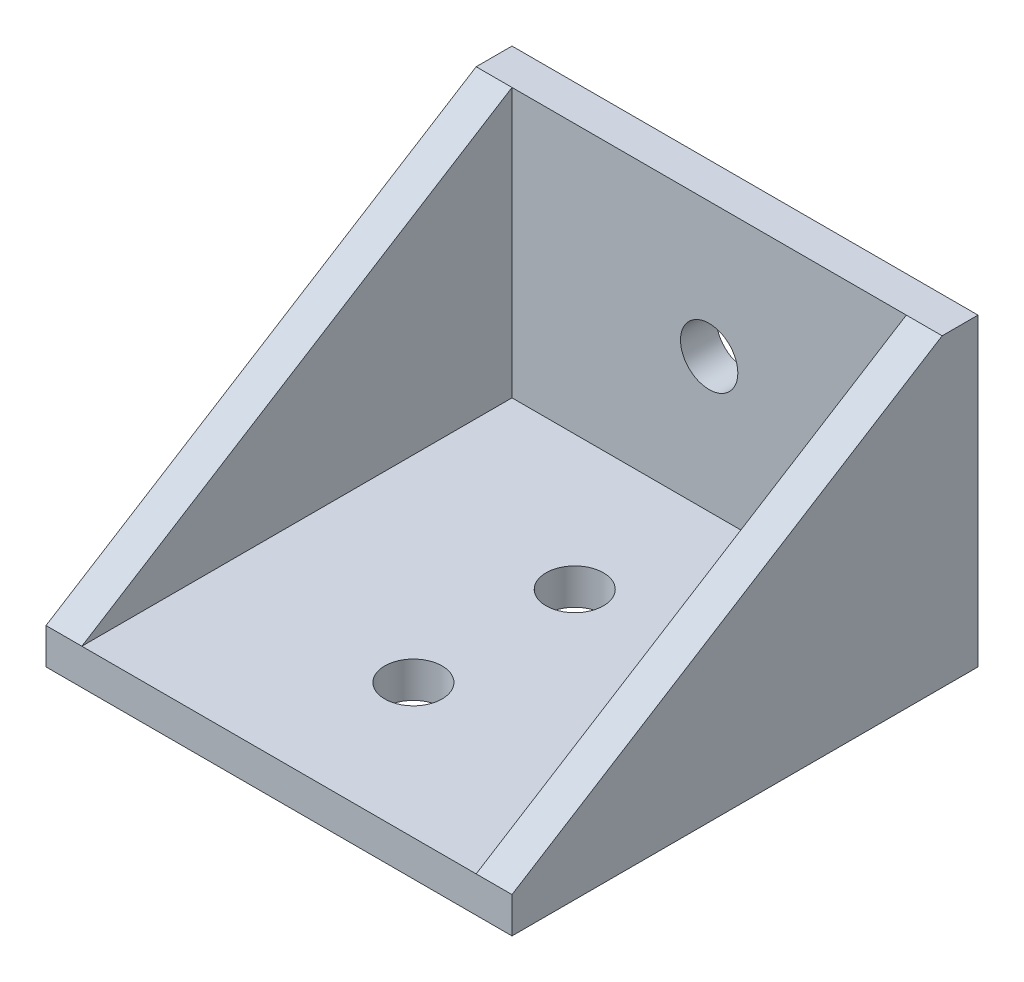
ISO-10303-21;
HEADER;
FILE_DESCRIPTION(('STEP AP214'),'2;1');
FILE_NAME('part.step','',(''),(''),'','','');
FILE_SCHEMA(('AUTOMOTIVE_DESIGN { 1 0 10303 214 1 1 1 1 }'));
ENDSEC;
DATA;
#1=APPLICATION_CONTEXT('core data for automotive mechanical design processes');
#2=APPLICATION_PROTOCOL_DEFINITION('international standard','automotive_design',2000,#1);
#3=PRODUCT_CONTEXT('',#1,'mechanical');
#4=PRODUCT('Part','Part','',(#3));
#5=PRODUCT_RELATED_PRODUCT_CATEGORY('part','',(#4));
#6=PRODUCT_DEFINITION_FORMATION('','',#4);
#7=PRODUCT_DEFINITION_CONTEXT('part definition',#1,'design');
#8=PRODUCT_DEFINITION('design','',#6,#7);
#9=PRODUCT_DEFINITION_SHAPE('','',#8);
#10=(LENGTH_UNIT() NAMED_UNIT(*) SI_UNIT(.MILLI.,.METRE.));
#11=(NAMED_UNIT(*) PLANE_ANGLE_UNIT() SI_UNIT($,.RADIAN.));
#12=(NAMED_UNIT(*) SI_UNIT($,.STERADIAN.) SOLID_ANGLE_UNIT());
#13=UNCERTAINTY_MEASURE_WITH_UNIT(LENGTH_MEASURE(1.E-05),#10,'distance_accuracy_value','');
#14=(GEOMETRIC_REPRESENTATION_CONTEXT(3) GLOBAL_UNCERTAINTY_ASSIGNED_CONTEXT((#13)) GLOBAL_UNIT_ASSIGNED_CONTEXT((#10,
#11,#12)) REPRESENTATION_CONTEXT('',''));
#15=CARTESIAN_POINT('',(0.,0.,0.));
#16=DIRECTION('',(0.,0.,1.));
#17=DIRECTION('',(1.,0.,0.));
#18=AXIS2_PLACEMENT_3D('',#15,#16,#17);
#19=CARTESIAN_POINT('',(-13.,17.,-11.));
#20=DIRECTION('',(0.,-0.847998304005088,-0.52999894000318));
#21=DIRECTION('',(0.,0.52999894000318,-0.847998304005088));
#22=AXIS2_PLACEMENT_3D('',#19,#20,#21);
#23=PLANE('',#22);
#24=DIRECTION('',(0.,0.52999894000318,-0.847998304005088));
#25=VECTOR('',#24,1.);
#26=CARTESIAN_POINT('',(11.,17.,-11.));
#27=LINE('',#26,#25);
#28=CARTESIAN_POINT('',(11.,2.,13.));
#29=VERTEX_POINT('',#28);
#30=CARTESIAN_POINT('',(11.,17.,-11.));
#31=VERTEX_POINT('',#30);
#32=EDGE_CURVE('E121',#29,#31,#27,.T.);
#33=ORIENTED_EDGE('',*,*,#32,.F.);
#34=DIRECTION('',(1.,0.,0.));
#35=VECTOR('',#34,1.);
#36=CARTESIAN_POINT('',(-13.,2.,13.));
#37=LINE('',#36,#35);
#38=CARTESIAN_POINT('',(13.,2.,13.));
#39=VERTEX_POINT('',#38);
#40=EDGE_CURVE('E127',#29,#39,#37,.T.);
#41=ORIENTED_EDGE('',*,*,#40,.T.);
#42=DIRECTION('',(0.,0.52999894000318,-0.847998304005088));
#43=VECTOR('',#42,1.);
#44=CARTESIAN_POINT('',(13.,17.,-11.));
#45=LINE('',#44,#43);
#46=CARTESIAN_POINT('',(13.,17.,-11.));
#47=VERTEX_POINT('',#46);
#48=EDGE_CURVE('E128',#39,#47,#45,.T.);
#49=ORIENTED_EDGE('',*,*,#48,.T.);
#50=DIRECTION('',(1.,0.,0.));
#51=VECTOR('',#50,1.);
#52=CARTESIAN_POINT('',(-13.,17.,-11.));
#53=LINE('',#52,#51);
#54=EDGE_CURVE('E56',#31,#47,#53,.T.);
#55=ORIENTED_EDGE('',*,*,#54,.F.);
#56=EDGE_LOOP('',(#33,#41,#49,#55));
#57=FACE_BOUND('',#56,.T.);
#58=ADVANCED_FACE('F33',(#57),#23,.F.);
#59=CARTESIAN_POINT('',(13.,17.,13.));
#60=DIRECTION('',(-1.,0.,0.));
#61=DIRECTION('',(0.,0.,1.));
#62=AXIS2_PLACEMENT_3D('',#59,#60,#61);
#63=PLANE('',#62);
#64=DIRECTION('',(0.,0.,-1.));
#65=VECTOR('',#64,1.);
#66=CARTESIAN_POINT('',(13.,17.,13.));
#67=LINE('',#66,#65);
#68=CARTESIAN_POINT('',(13.,17.,-13.));
#69=VERTEX_POINT('',#68);
#70=EDGE_CURVE('E137',#47,#69,#67,.T.);
#71=ORIENTED_EDGE('',*,*,#70,.F.);
#72=ORIENTED_EDGE('',*,*,#48,.F.);
#73=DIRECTION('',(0.,-1.,0.));
#74=VECTOR('',#73,1.);
#75=CARTESIAN_POINT('',(13.,17.,13.));
#76=LINE('',#75,#74);
#77=CARTESIAN_POINT('',(13.,0.,13.));
#78=VERTEX_POINT('',#77);
#79=EDGE_CURVE('E145',#39,#78,#76,.T.);
#80=ORIENTED_EDGE('',*,*,#79,.T.);
#81=DIRECTION('',(0.,0.,-1.));
#82=VECTOR('',#81,1.);
#83=CARTESIAN_POINT('',(13.,0.,13.));
#84=LINE('',#83,#82);
#85=CARTESIAN_POINT('',(13.,0.,-13.));
#86=VERTEX_POINT('',#85);
#87=EDGE_CURVE('E133',#78,#86,#84,.T.);
#88=ORIENTED_EDGE('',*,*,#87,.T.);
#89=DIRECTION('',(0.,-1.,0.));
#90=VECTOR('',#89,1.);
#91=CARTESIAN_POINT('',(13.,17.,-13.));
#92=LINE('',#91,#90);
#93=EDGE_CURVE('E11',#69,#86,#92,.T.);
#94=ORIENTED_EDGE('',*,*,#93,.F.);
#95=EDGE_LOOP('',(#71,#72,#80,#88,#94));
#96=FACE_BOUND('',#95,.T.);
#97=ADVANCED_FACE('F35',(#96),#63,.F.);
#98=CARTESIAN_POINT('',(-13.,17.,-13.));
#99=DIRECTION('',(0.,0.,1.));
#100=DIRECTION('',(1.,0.,0.));
#101=AXIS2_PLACEMENT_3D('',#98,#99,#100);
#102=PLANE('',#101);
#103=CARTESIAN_POINT('',(0.,9.5,-13.));
#104=DIRECTION('',(0.,0.,1.));
#105=DIRECTION('',(1.,0.,0.));
#106=AXIS2_PLACEMENT_3D('',#103,#104,#105);
#107=CIRCLE('',#106,1.6);
#108=CARTESIAN_POINT('',(1.6,9.5,-13.));
#109=VERTEX_POINT('',#108);
#110=EDGE_CURVE('E291',#109,#109,#107,.T.);
#111=ORIENTED_EDGE('',*,*,#110,.T.);
#112=EDGE_LOOP('',(#111));
#113=FACE_BOUND('',#112,.T.);
#114=DIRECTION('',(-1.,0.,0.));
#115=VECTOR('',#114,1.);
#116=CARTESIAN_POINT('',(-13.,0.,-13.));
#117=LINE('',#116,#115);
#118=CARTESIAN_POINT('',(-13.,0.,-13.));
#119=VERTEX_POINT('',#118);
#120=EDGE_CURVE('E148',#86,#119,#117,.T.);
#121=ORIENTED_EDGE('',*,*,#120,.T.);
#122=DIRECTION('',(0.,-1.,0.));
#123=VECTOR('',#122,1.);
#124=CARTESIAN_POINT('',(-13.,17.,-13.));
#125=LINE('',#124,#123);
#126=CARTESIAN_POINT('',(-13.,17.,-13.));
#127=VERTEX_POINT('',#126);
#128=EDGE_CURVE('E41',#127,#119,#125,.T.);
#129=ORIENTED_EDGE('',*,*,#128,.F.);
#130=DIRECTION('',(-1.,0.,0.));
#131=VECTOR('',#130,1.);
#132=CARTESIAN_POINT('',(-13.,17.,-13.));
#133=LINE('',#132,#131);
#134=EDGE_CURVE('E139',#69,#127,#133,.T.);
#135=ORIENTED_EDGE('',*,*,#134,.F.);
#136=ORIENTED_EDGE('',*,*,#93,.T.);
#137=EDGE_LOOP('',(#121,#129,#135,#136));
#138=FACE_BOUND('',#137,.T.);
#139=ADVANCED_FACE('F179',(#113,#138),#102,.F.);
#140=CARTESIAN_POINT('',(-13.,17.,13.));
#141=DIRECTION('',(1.,0.,0.));
#142=DIRECTION('',(0.,0.,-1.));
#143=AXIS2_PLACEMENT_3D('',#140,#141,#142);
#144=PLANE('',#143);
#145=DIRECTION('',(0.,-1.,0.));
#146=VECTOR('',#145,1.);
#147=CARTESIAN_POINT('',(-13.,17.,13.));
#148=LINE('',#147,#146);
#149=CARTESIAN_POINT('',(-13.,2.,13.));
#150=VERTEX_POINT('',#149);
#151=CARTESIAN_POINT('',(-13.,0.,13.));
#152=VERTEX_POINT('',#151);
#153=EDGE_CURVE('E156',#150,#152,#148,.T.);
#154=ORIENTED_EDGE('',*,*,#153,.F.);
#155=DIRECTION('',(0.,0.52999894000318,-0.847998304005088));
#156=VECTOR('',#155,1.);
#157=CARTESIAN_POINT('',(-13.,17.,-11.));
#158=LINE('',#157,#156);
#159=CARTESIAN_POINT('',(-13.,17.,-11.));
#160=VERTEX_POINT('',#159);
#161=EDGE_CURVE('E124',#150,#160,#158,.T.);
#162=ORIENTED_EDGE('',*,*,#161,.T.);
#163=DIRECTION('',(0.,0.,1.));
#164=VECTOR('',#163,1.);
#165=CARTESIAN_POINT('',(-13.,17.,13.));
#166=LINE('',#165,#164);
#167=EDGE_CURVE('E142',#127,#160,#166,.T.);
#168=ORIENTED_EDGE('',*,*,#167,.F.);
#169=ORIENTED_EDGE('',*,*,#128,.T.);
#170=DIRECTION('',(0.,0.,1.));
#171=VECTOR('',#170,1.);
#172=CARTESIAN_POINT('',(-13.,0.,13.));
#173=LINE('',#172,#171);
#174=EDGE_CURVE('E150',#119,#152,#173,.T.);
#175=ORIENTED_EDGE('',*,*,#174,.T.);
#176=EDGE_LOOP('',(#154,#162,#168,#169,#175));
#177=FACE_BOUND('',#176,.T.);
#178=ADVANCED_FACE('F163',(#177),#144,.F.);
#179=CARTESIAN_POINT('',(-13.,17.,13.));
#180=DIRECTION('',(0.,0.,-1.));
#181=DIRECTION('',(-1.,0.,0.));
#182=AXIS2_PLACEMENT_3D('',#179,#180,#181);
#183=PLANE('',#182);
#184=ORIENTED_EDGE('',*,*,#79,.F.);
#185=ORIENTED_EDGE('',*,*,#40,.F.);
#186=DIRECTION('',(1.,0.,0.));
#187=VECTOR('',#186,1.);
#188=CARTESIAN_POINT('',(-13.,2.,13.));
#189=LINE('',#188,#187);
#190=CARTESIAN_POINT('',(-11.,2.,13.));
#191=VERTEX_POINT('',#190);
#192=EDGE_CURVE('E120',#191,#29,#189,.T.);
#193=ORIENTED_EDGE('',*,*,#192,.F.);
#194=EDGE_CURVE('E134',#150,#191,#37,.T.);
#195=ORIENTED_EDGE('',*,*,#194,.F.);
#196=ORIENTED_EDGE('',*,*,#153,.T.);
#197=DIRECTION('',(1.,0.,0.));
#198=VECTOR('',#197,1.);
#199=CARTESIAN_POINT('',(-13.,0.,13.));
#200=LINE('',#199,#198);
#201=EDGE_CURVE('E140',#152,#78,#200,.T.);
#202=ORIENTED_EDGE('',*,*,#201,.T.);
#203=EDGE_LOOP('',(#184,#185,#193,#195,#196,#202));
#204=FACE_BOUND('',#203,.T.);
#205=ADVANCED_FACE('F172',(#204),#183,.F.);
#206=CARTESIAN_POINT('',(0.,17.,0.));
#207=DIRECTION('',(0.,-1.,0.));
#208=DIRECTION('',(0.,0.,-1.));
#209=AXIS2_PLACEMENT_3D('',#206,#207,#208);
#210=PLANE('',#209);
#211=ORIENTED_EDGE('',*,*,#167,.T.);
#212=CARTESIAN_POINT('',(-11.,17.,-11.));
#213=VERTEX_POINT('',#212);
#214=EDGE_CURVE('E130',#160,#213,#53,.T.);
#215=ORIENTED_EDGE('',*,*,#214,.T.);
#216=DIRECTION('',(1.,0.,0.));
#217=VECTOR('',#216,1.);
#218=CARTESIAN_POINT('',(-13.,17.,-11.));
#219=LINE('',#218,#217);
#220=EDGE_CURVE('E111',#213,#31,#219,.T.);
#221=ORIENTED_EDGE('',*,*,#220,.T.);
#222=ORIENTED_EDGE('',*,*,#54,.T.);
#223=ORIENTED_EDGE('',*,*,#70,.T.);
#224=ORIENTED_EDGE('',*,*,#134,.T.);
#225=EDGE_LOOP('',(#211,#215,#221,#222,#223,#224));
#226=FACE_BOUND('',#225,.T.);
#227=ADVANCED_FACE('F176',(#226),#210,.F.);
#228=CARTESIAN_POINT('',(0.,0.,0.));
#229=DIRECTION('',(0.,-1.,0.));
#230=DIRECTION('',(0.,0.,-1.));
#231=AXIS2_PLACEMENT_3D('',#228,#229,#230);
#232=PLANE('',#231);
#233=CARTESIAN_POINT('',(0.,0.,-3.5));
#234=DIRECTION('',(0.,1.,0.));
#235=DIRECTION('',(0.,0.,1.));
#236=AXIS2_PLACEMENT_3D('',#233,#234,#235);
#237=CIRCLE('',#236,1.6);
#238=CARTESIAN_POINT('',(0.,0.,-1.9));
#239=VERTEX_POINT('',#238);
#240=EDGE_CURVE('E123',#239,#239,#237,.T.);
#241=ORIENTED_EDGE('',*,*,#240,.T.);
#242=EDGE_LOOP('',(#241));
#243=FACE_BOUND('',#242,.T.);
#244=CARTESIAN_POINT('',(0.,0.,5.5));
#245=DIRECTION('',(0.,1.,0.));
#246=DIRECTION('',(0.,0.,1.));
#247=AXIS2_PLACEMENT_3D('',#244,#245,#246);
#248=CIRCLE('',#247,1.6);
#249=CARTESIAN_POINT('',(0.,0.,7.1));
#250=VERTEX_POINT('',#249);
#251=EDGE_CURVE('E304',#250,#250,#248,.T.);
#252=ORIENTED_EDGE('',*,*,#251,.T.);
#253=EDGE_LOOP('',(#252));
#254=FACE_BOUND('',#253,.T.);
#255=ORIENTED_EDGE('',*,*,#87,.F.);
#256=ORIENTED_EDGE('',*,*,#201,.F.);
#257=ORIENTED_EDGE('',*,*,#174,.F.);
#258=ORIENTED_EDGE('',*,*,#120,.F.);
#259=EDGE_LOOP('',(#255,#256,#257,#258));
#260=FACE_BOUND('',#259,.T.);
#261=ADVANCED_FACE('F169',(#243,#254,#260),#232,.T.);
#262=ORIENTED_EDGE('',*,*,#194,.T.);
#263=DIRECTION('',(0.,0.52999894000318,-0.847998304005088));
#264=VECTOR('',#263,1.);
#265=CARTESIAN_POINT('',(-11.,6.21348314606742,6.25842696629213));
#266=LINE('',#265,#264);
#267=EDGE_CURVE('E116',#191,#213,#266,.T.);
#268=ORIENTED_EDGE('',*,*,#267,.T.);
#269=ORIENTED_EDGE('',*,*,#214,.F.);
#270=ORIENTED_EDGE('',*,*,#161,.F.);
#271=EDGE_LOOP('',(#262,#268,#269,#270));
#272=FACE_BOUND('',#271,.T.);
#273=ADVANCED_FACE('F185',(#272),#23,.F.);
#274=CARTESIAN_POINT('',(11.,17.,13.));
#275=DIRECTION('',(-1.,0.,0.));
#276=DIRECTION('',(0.,0.,1.));
#277=AXIS2_PLACEMENT_3D('',#274,#275,#276);
#278=PLANE('',#277);
#279=DIRECTION('',(0.,-1.,0.));
#280=VECTOR('',#279,1.);
#281=CARTESIAN_POINT('',(11.,17.,-11.));
#282=LINE('',#281,#280);
#283=CARTESIAN_POINT('',(11.,2.,-11.));
#284=VERTEX_POINT('',#283);
#285=EDGE_CURVE('E48',#31,#284,#282,.T.);
#286=ORIENTED_EDGE('',*,*,#285,.T.);
#287=DIRECTION('',(0.,0.,-1.));
#288=VECTOR('',#287,1.);
#289=CARTESIAN_POINT('',(11.,2.,0.));
#290=LINE('',#289,#288);
#291=EDGE_CURVE('E107',#29,#284,#290,.T.);
#292=ORIENTED_EDGE('',*,*,#291,.F.);
#293=ORIENTED_EDGE('',*,*,#32,.T.);
#294=EDGE_LOOP('',(#286,#292,#293));
#295=FACE_BOUND('',#294,.T.);
#296=ADVANCED_FACE('F187',(#295),#278,.T.);
#297=CARTESIAN_POINT('',(-13.,17.,-11.));
#298=DIRECTION('',(0.,0.,1.));
#299=DIRECTION('',(1.,0.,0.));
#300=AXIS2_PLACEMENT_3D('',#297,#298,#299);
#301=PLANE('',#300);
#302=CARTESIAN_POINT('',(0.,9.5,-11.));
#303=DIRECTION('',(0.,0.,1.));
#304=DIRECTION('',(1.,0.,0.));
#305=AXIS2_PLACEMENT_3D('',#302,#303,#304);
#306=CIRCLE('',#305,1.6);
#307=CARTESIAN_POINT('',(1.6,9.5,-11.));
#308=VERTEX_POINT('',#307);
#309=EDGE_CURVE('E294',#308,#308,#306,.T.);
#310=ORIENTED_EDGE('',*,*,#309,.F.);
#311=EDGE_LOOP('',(#310));
#312=FACE_BOUND('',#311,.T.);
#313=DIRECTION('',(-1.,0.,0.));
#314=VECTOR('',#313,1.);
#315=CARTESIAN_POINT('',(0.,2.,-11.));
#316=LINE('',#315,#314);
#317=CARTESIAN_POINT('',(-11.,2.,-11.));
#318=VERTEX_POINT('',#317);
#319=EDGE_CURVE('E100',#284,#318,#316,.T.);
#320=ORIENTED_EDGE('',*,*,#319,.F.);
#321=ORIENTED_EDGE('',*,*,#285,.F.);
#322=ORIENTED_EDGE('',*,*,#220,.F.);
#323=DIRECTION('',(0.,-1.,0.));
#324=VECTOR('',#323,1.);
#325=CARTESIAN_POINT('',(-11.,17.,-11.));
#326=LINE('',#325,#324);
#327=EDGE_CURVE('E109',#213,#318,#326,.T.);
#328=ORIENTED_EDGE('',*,*,#327,.T.);
#329=EDGE_LOOP('',(#320,#321,#322,#328));
#330=FACE_BOUND('',#329,.T.);
#331=ADVANCED_FACE('F110',(#312,#330),#301,.T.);
#332=CARTESIAN_POINT('',(-11.,17.,13.));
#333=DIRECTION('',(1.,0.,0.));
#334=DIRECTION('',(0.,0.,-1.));
#335=AXIS2_PLACEMENT_3D('',#332,#333,#334);
#336=PLANE('',#335);
#337=DIRECTION('',(0.,0.,1.));
#338=VECTOR('',#337,1.);
#339=CARTESIAN_POINT('',(-11.,2.,0.));
#340=LINE('',#339,#338);
#341=EDGE_CURVE('E105',#318,#191,#340,.T.);
#342=ORIENTED_EDGE('',*,*,#341,.F.);
#343=ORIENTED_EDGE('',*,*,#327,.F.);
#344=ORIENTED_EDGE('',*,*,#267,.F.);
#345=EDGE_LOOP('',(#342,#343,#344));
#346=FACE_BOUND('',#345,.T.);
#347=ADVANCED_FACE('F115',(#346),#336,.T.);
#348=CARTESIAN_POINT('',(0.,2.,0.));
#349=DIRECTION('',(0.,-1.,0.));
#350=DIRECTION('',(0.,0.,-1.));
#351=AXIS2_PLACEMENT_3D('',#348,#349,#350);
#352=PLANE('',#351);
#353=CARTESIAN_POINT('',(0.,2.,-3.5));
#354=DIRECTION('',(0.,1.,0.));
#355=DIRECTION('',(0.,0.,1.));
#356=AXIS2_PLACEMENT_3D('',#353,#354,#355);
#357=CIRCLE('',#356,1.6);
#358=CARTESIAN_POINT('',(0.,2.,-1.9));
#359=VERTEX_POINT('',#358);
#360=EDGE_CURVE('E301',#359,#359,#357,.T.);
#361=ORIENTED_EDGE('',*,*,#360,.F.);
#362=EDGE_LOOP('',(#361));
#363=FACE_BOUND('',#362,.T.);
#364=CARTESIAN_POINT('',(0.,2.,5.5));
#365=DIRECTION('',(0.,1.,0.));
#366=DIRECTION('',(0.,0.,1.));
#367=AXIS2_PLACEMENT_3D('',#364,#365,#366);
#368=CIRCLE('',#367,1.6);
#369=CARTESIAN_POINT('',(0.,2.,7.1));
#370=VERTEX_POINT('',#369);
#371=EDGE_CURVE('E296',#370,#370,#368,.T.);
#372=ORIENTED_EDGE('',*,*,#371,.F.);
#373=EDGE_LOOP('',(#372));
#374=FACE_BOUND('',#373,.T.);
#375=ORIENTED_EDGE('',*,*,#291,.T.);
#376=ORIENTED_EDGE('',*,*,#319,.T.);
#377=ORIENTED_EDGE('',*,*,#341,.T.);
#378=ORIENTED_EDGE('',*,*,#192,.T.);
#379=EDGE_LOOP('',(#375,#376,#377,#378));
#380=FACE_BOUND('',#379,.T.);
#381=ADVANCED_FACE('F102',(#363,#374,#380),#352,.F.);
#382=CARTESIAN_POINT('',(0.,0.,5.5));
#383=DIRECTION('',(0.,1.,0.));
#384=DIRECTION('',(0.,0.,1.));
#385=AXIS2_PLACEMENT_3D('',#382,#383,#384);
#386=CYLINDRICAL_SURFACE('',#385,1.6);
#387=ORIENTED_EDGE('',*,*,#251,.F.);
#388=EDGE_LOOP('',(#387));
#389=FACE_BOUND('',#388,.T.);
#390=ORIENTED_EDGE('',*,*,#371,.T.);
#391=EDGE_LOOP('',(#390));
#392=FACE_BOUND('',#391,.T.);
#393=ADVANCED_FACE('F238',(#389,#392),#386,.F.);
#394=CARTESIAN_POINT('',(0.,0.,-3.5));
#395=DIRECTION('',(0.,1.,0.));
#396=DIRECTION('',(0.,0.,1.));
#397=AXIS2_PLACEMENT_3D('',#394,#395,#396);
#398=CYLINDRICAL_SURFACE('',#397,1.6);
#399=ORIENTED_EDGE('',*,*,#240,.F.);
#400=EDGE_LOOP('',(#399));
#401=FACE_BOUND('',#400,.T.);
#402=ORIENTED_EDGE('',*,*,#360,.T.);
#403=EDGE_LOOP('',(#402));
#404=FACE_BOUND('',#403,.T.);
#405=ADVANCED_FACE('F247',(#401,#404),#398,.F.);
#406=CARTESIAN_POINT('',(0.,9.5,-13.));
#407=DIRECTION('',(0.,0.,1.));
#408=DIRECTION('',(1.,0.,0.));
#409=AXIS2_PLACEMENT_3D('',#406,#407,#408);
#410=CYLINDRICAL_SURFACE('',#409,1.6);
#411=ORIENTED_EDGE('',*,*,#110,.F.);
#412=EDGE_LOOP('',(#411));
#413=FACE_BOUND('',#412,.T.);
#414=ORIENTED_EDGE('',*,*,#309,.T.);
#415=EDGE_LOOP('',(#414));
#416=FACE_BOUND('',#415,.T.);
#417=ADVANCED_FACE('F256',(#413,#416),#410,.F.);
#418=CLOSED_SHELL('',(#58,#97,#139,#178,#205,#227,#261,#273,#296,#331,#347,#381,#393,#405,#417));
#419=MANIFOLD_SOLID_BREP('B2',#418);
#420=ADVANCED_BREP_SHAPE_REPRESENTATION('',(#18,#419),#14);
#421=SHAPE_DEFINITION_REPRESENTATION(#9,#420);
ENDSEC;
END-ISO-10303-21;
